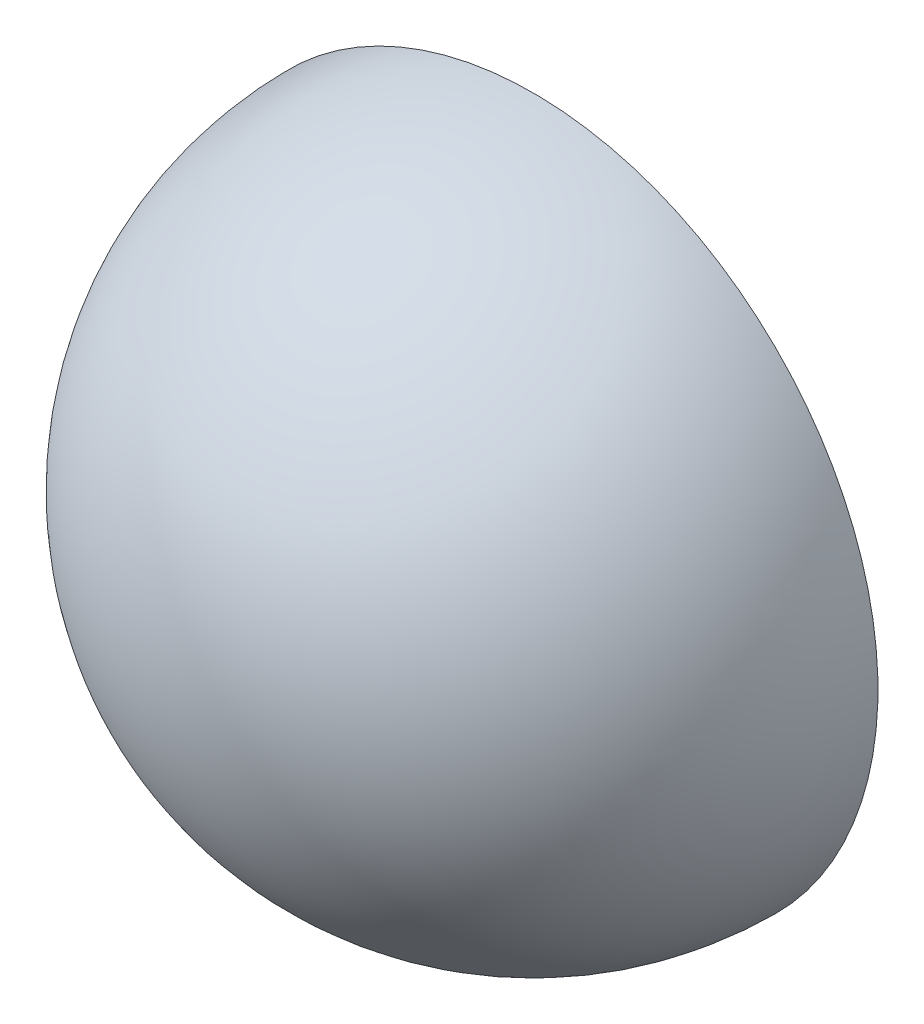
ISO-10303-21;
HEADER;
FILE_DESCRIPTION(('STEP AP214'),'2;1');
FILE_NAME('part.step','',(''),(''),'','','');
FILE_SCHEMA(('AUTOMOTIVE_DESIGN { 1 0 10303 214 1 1 1 1 }'));
ENDSEC;
DATA;
#1=APPLICATION_CONTEXT('core data for automotive mechanical design processes');
#2=APPLICATION_PROTOCOL_DEFINITION('international standard','automotive_design',2000,#1);
#3=PRODUCT_CONTEXT('',#1,'mechanical');
#4=PRODUCT('Part','Part','',(#3));
#5=PRODUCT_RELATED_PRODUCT_CATEGORY('part','',(#4));
#6=PRODUCT_DEFINITION_FORMATION('','',#4);
#7=PRODUCT_DEFINITION_CONTEXT('part definition',#1,'design');
#8=PRODUCT_DEFINITION('design','',#6,#7);
#9=PRODUCT_DEFINITION_SHAPE('','',#8);
#10=(LENGTH_UNIT() NAMED_UNIT(*) SI_UNIT(.MILLI.,.METRE.));
#11=(NAMED_UNIT(*) PLANE_ANGLE_UNIT() SI_UNIT($,.RADIAN.));
#12=(NAMED_UNIT(*) SI_UNIT($,.STERADIAN.) SOLID_ANGLE_UNIT());
#13=UNCERTAINTY_MEASURE_WITH_UNIT(LENGTH_MEASURE(1.E-05),#10,'distance_accuracy_value','');
#14=(GEOMETRIC_REPRESENTATION_CONTEXT(3) GLOBAL_UNCERTAINTY_ASSIGNED_CONTEXT((#13)) GLOBAL_UNIT_ASSIGNED_CONTEXT((#10,
#11,#12)) REPRESENTATION_CONTEXT('',''));
#15=CARTESIAN_POINT('',(0.,0.,0.));
#16=DIRECTION('',(0.,0.,1.));
#17=DIRECTION('',(1.,0.,0.));
#18=AXIS2_PLACEMENT_3D('',#15,#16,#17);
#19=CARTESIAN_POINT('',(0.,0.,0.));
#20=DIRECTION('',(0.,1.,0.));
#21=DIRECTION('',(-1.,0.,0.));
#22=AXIS2_PLACEMENT_3D('',#19,#20,#21);
#23=SPHERICAL_SURFACE('',#22,98.);
#24=CARTESIAN_POINT('',(0.,0.,0.));
#25=DIRECTION('',(0.,0.,1.));
#26=DIRECTION('',(-1.,0.,0.));
#27=AXIS2_PLACEMENT_3D('',#24,#25,#26);
#28=SPHERICAL_SURFACE('',#27,98.);
#29=CARTESIAN_POINT('',(0.,0.,0.));
#30=DIRECTION('',(0.,0.,1.));
#31=DIRECTION('',(-1.,0.,0.));
#32=AXIS2_PLACEMENT_3D('',#29,#30,#31);
#33=CIRCLE('',#32,98.);
#34=CARTESIAN_POINT('',(-98.,0.,-6.84330342413254E-13));
#35=VERTEX_POINT('',#34);
#36=EDGE_CURVE('E39',#35,#35,#33,.T.);
#37=ORIENTED_EDGE('',*,*,#36,.F.);
#38=EDGE_LOOP('',(#37));
#39=FACE_BOUND('',#38,.T.);
#40=ADVANCED_FACE('F32',(#39),#28,.F.);
#41=CARTESIAN_POINT('',(0.,0.,0.));
#42=DIRECTION('',(0.,1.,0.));
#43=DIRECTION('',(1.,0.,0.));
#44=AXIS2_PLACEMENT_3D('',#41,#42,#43);
#45=SPHERICAL_SURFACE('',#44,100.);
#46=CARTESIAN_POINT('',(0.,0.,0.));
#47=DIRECTION('',(0.,0.,-1.));
#48=DIRECTION('',(-1.,0.,0.));
#49=AXIS2_PLACEMENT_3D('',#46,#47,#48);
#50=SPHERICAL_SURFACE('',#49,100.);
#51=CARTESIAN_POINT('',(0.,0.,0.));
#52=DIRECTION('',(0.,0.,-1.));
#53=DIRECTION('',(-1.,0.,0.));
#54=AXIS2_PLACEMENT_3D('',#51,#52,#53);
#55=CIRCLE('',#54,100.);
#56=CARTESIAN_POINT('',(-100.,0.,-6.98296267768627E-13));
#57=VERTEX_POINT('',#56);
#58=EDGE_CURVE('E10',#57,#57,#55,.T.);
#59=ORIENTED_EDGE('',*,*,#58,.F.);
#60=EDGE_LOOP('',(#59));
#61=FACE_BOUND('',#60,.T.);
#62=ADVANCED_FACE('F34',(#61),#50,.T.);
#63=CARTESIAN_POINT('',(0.,0.,0.));
#64=DIRECTION('',(0.,0.,-1.));
#65=DIRECTION('',(-1.,0.,0.));
#66=AXIS2_PLACEMENT_3D('',#63,#64,#65);
#67=PLANE('',#66);
#68=ORIENTED_EDGE('',*,*,#58,.T.);
#69=EDGE_LOOP('',(#68));
#70=FACE_BOUND('',#69,.T.);
#71=ORIENTED_EDGE('',*,*,#36,.T.);
#72=EDGE_LOOP('',(#71));
#73=FACE_BOUND('',#72,.T.);
#74=ADVANCED_FACE('F45',(#70,#73),#67,.T.);
#75=CLOSED_SHELL('',(#40,#62,#74));
#76=MANIFOLD_SOLID_BREP('B2',#75);
#77=ADVANCED_BREP_SHAPE_REPRESENTATION('',(#18,#76),#14);
#78=SHAPE_DEFINITION_REPRESENTATION(#9,#77);
ENDSEC;
END-ISO-10303-21;
